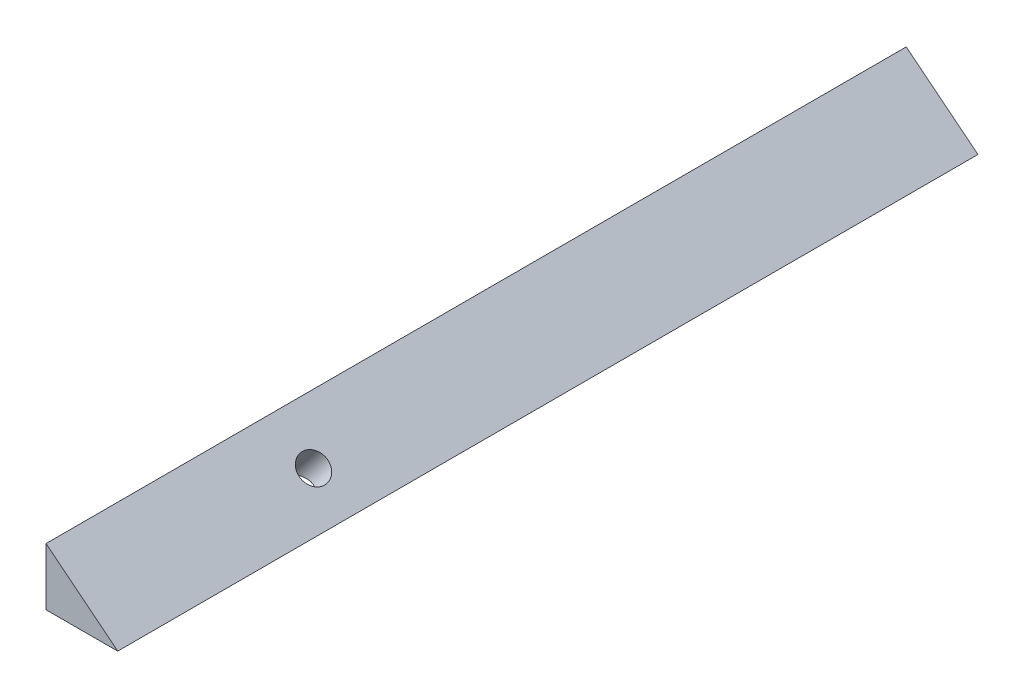
ISO-10303-21;
HEADER;
FILE_DESCRIPTION(('STEP AP214'),'2;1');
FILE_NAME('part.step','',(''),(''),'','','');
FILE_SCHEMA(('AUTOMOTIVE_DESIGN { 1 0 10303 214 1 1 1 1 }'));
ENDSEC;
DATA;
#1=APPLICATION_CONTEXT('core data for automotive mechanical design processes');
#2=APPLICATION_PROTOCOL_DEFINITION('international standard','automotive_design',2000,#1);
#3=PRODUCT_CONTEXT('',#1,'mechanical');
#4=PRODUCT('Part','Part','',(#3));
#5=PRODUCT_RELATED_PRODUCT_CATEGORY('part','',(#4));
#6=PRODUCT_DEFINITION_FORMATION('','',#4);
#7=PRODUCT_DEFINITION_CONTEXT('part definition',#1,'design');
#8=PRODUCT_DEFINITION('design','',#6,#7);
#9=PRODUCT_DEFINITION_SHAPE('','',#8);
#10=(LENGTH_UNIT() NAMED_UNIT(*) SI_UNIT(.MILLI.,.METRE.));
#11=(NAMED_UNIT(*) PLANE_ANGLE_UNIT() SI_UNIT($,.RADIAN.));
#12=(NAMED_UNIT(*) SI_UNIT($,.STERADIAN.) SOLID_ANGLE_UNIT());
#13=UNCERTAINTY_MEASURE_WITH_UNIT(LENGTH_MEASURE(1.E-05),#10,'distance_accuracy_value','');
#14=(GEOMETRIC_REPRESENTATION_CONTEXT(3) GLOBAL_UNCERTAINTY_ASSIGNED_CONTEXT((#13)) GLOBAL_UNIT_ASSIGNED_CONTEXT((#10,
#11,#12)) REPRESENTATION_CONTEXT('',''));
#15=CARTESIAN_POINT('',(0.,0.,0.));
#16=DIRECTION('',(0.,0.,1.));
#17=DIRECTION('',(1.,0.,0.));
#18=AXIS2_PLACEMENT_3D('',#15,#16,#17);
#19=CARTESIAN_POINT('',(0.,0.,-38.1));
#20=DIRECTION('',(1.,0.,0.));
#21=DIRECTION('',(0.,0.,-1.));
#22=AXIS2_PLACEMENT_3D('',#19,#20,#21);
#23=PLANE('',#22);
#24=DIRECTION('',(0.,0.,1.));
#25=VECTOR('',#24,1.);
#26=CARTESIAN_POINT('',(0.,0.,-38.1));
#27=LINE('',#26,#25);
#28=CARTESIAN_POINT('',(0.,0.,-469.9));
#29=VERTEX_POINT('',#28);
#30=CARTESIAN_POINT('',(0.,0.,83.4795863754));
#31=VERTEX_POINT('',#30);
#32=EDGE_CURVE('E79',#29,#31,#27,.T.);
#33=ORIENTED_EDGE('',*,*,#32,.T.);
#34=CARTESIAN_POINT('',(0.,-18.385241638452,88.9));
#35=DIRECTION('',(1.,0.,0.));
#36=DIRECTION('',(0.,1.,0.));
#37=AXIS2_PLACEMENT_3D('',#34,#35,#36);
#38=ELLIPSE('',#37,20.3299194538493,12.7);
#39=CARTESIAN_POINT('',(0.,0.,94.3204136245998));
#40=VERTEX_POINT('',#39);
#41=EDGE_CURVE('E46',#31,#40,#38,.T.);
#42=ORIENTED_EDGE('',*,*,#41,.T.);
#43=CARTESIAN_POINT('',(0.,0.,292.1));
#44=VERTEX_POINT('',#43);
#45=EDGE_CURVE('E76',#40,#44,#27,.T.);
#46=ORIENTED_EDGE('',*,*,#45,.T.);
#47=DIRECTION('',(0.,-1.,0.));
#48=VECTOR('',#47,1.);
#49=CARTESIAN_POINT('',(0.,50.8,292.1));
#50=LINE('',#49,#48);
#51=CARTESIAN_POINT('',(0.,50.8,292.1));
#52=VERTEX_POINT('',#51);
#53=EDGE_CURVE('E85',#52,#44,#50,.T.);
#54=ORIENTED_EDGE('',*,*,#53,.F.);
#55=DIRECTION('',(0.,0.,1.));
#56=VECTOR('',#55,1.);
#57=CARTESIAN_POINT('',(0.,50.8,-38.1));
#58=LINE('',#57,#56);
#59=CARTESIAN_POINT('',(0.,50.8,-469.9));
#60=VERTEX_POINT('',#59);
#61=EDGE_CURVE('E41',#60,#52,#58,.T.);
#62=ORIENTED_EDGE('',*,*,#61,.F.);
#63=DIRECTION('',(0.,1.,0.));
#64=VECTOR('',#63,1.);
#65=CARTESIAN_POINT('',(0.,0.,-469.9));
#66=LINE('',#65,#64);
#67=EDGE_CURVE('E80',#29,#60,#66,.T.);
#68=ORIENTED_EDGE('',*,*,#67,.F.);
#69=EDGE_LOOP('',(#33,#42,#46,#54,#62,#68));
#70=FACE_BOUND('',#69,.T.);
#71=ADVANCED_FACE('F34',(#70),#23,.F.);
#72=CARTESIAN_POINT('',(24.7804878048781,30.9756097560976,-38.1));
#73=DIRECTION('',(0.624695047554424,0.78086880944303,0.));
#74=DIRECTION('',(-0.78086880944303,0.624695047554424,0.));
#75=AXIS2_PLACEMENT_3D('',#72,#73,#74);
#76=PLANE('',#75);
#77=CARTESIAN_POINT('',(33.7488983602206,23.8008813118236,88.9));
#78=DIRECTION('',(0.624695047554424,0.78086880944303,0.));
#79=DIRECTION('',(-0.78086880944303,0.624695047554424,0.));
#80=AXIS2_PLACEMENT_3D('',#77,#78,#79);
#81=CIRCLE('',#80,12.7);
#82=CARTESIAN_POINT('',(23.8318644802941,31.7345084157648,88.9));
#83=VERTEX_POINT('',#82);
#84=EDGE_CURVE('E81',#83,#83,#81,.T.);
#85=ORIENTED_EDGE('',*,*,#84,.F.);
#86=EDGE_LOOP('',(#85));
#87=FACE_BOUND('',#86,.T.);
#88=ORIENTED_EDGE('',*,*,#61,.T.);
#89=DIRECTION('',(-0.78086880944303,0.624695047554424,0.));
#90=VECTOR('',#89,1.);
#91=CARTESIAN_POINT('',(63.5,0.,292.1));
#92=LINE('',#91,#90);
#93=CARTESIAN_POINT('',(63.5,0.,292.1));
#94=VERTEX_POINT('',#93);
#95=EDGE_CURVE('E91',#94,#52,#92,.T.);
#96=ORIENTED_EDGE('',*,*,#95,.F.);
#97=DIRECTION('',(0.,0.,1.));
#98=VECTOR('',#97,1.);
#99=CARTESIAN_POINT('',(63.5,0.,-38.1));
#100=LINE('',#99,#98);
#101=CARTESIAN_POINT('',(63.5,0.,-469.9));
#102=VERTEX_POINT('',#101);
#103=EDGE_CURVE('E54',#102,#94,#100,.T.);
#104=ORIENTED_EDGE('',*,*,#103,.F.);
#105=DIRECTION('',(0.78086880944303,-0.624695047554424,0.));
#106=VECTOR('',#105,1.);
#107=CARTESIAN_POINT('',(0.,50.8,-469.9));
#108=LINE('',#107,#106);
#109=EDGE_CURVE('E97',#60,#102,#108,.T.);
#110=ORIENTED_EDGE('',*,*,#109,.F.);
#111=EDGE_LOOP('',(#88,#96,#104,#110));
#112=FACE_BOUND('',#111,.T.);
#113=ADVANCED_FACE('F106',(#87,#112),#76,.T.);
#114=CARTESIAN_POINT('',(0.,0.,-38.1));
#115=DIRECTION('',(0.,-1.,0.));
#116=DIRECTION('',(0.,0.,-1.));
#117=AXIS2_PLACEMENT_3D('',#114,#115,#116);
#118=PLANE('',#117);
#119=CARTESIAN_POINT('',(14.7081933107616,0.,88.9));
#120=DIRECTION('',(0.,-1.,0.));
#121=DIRECTION('',(1.,0.,0.));
#122=AXIS2_PLACEMENT_3D('',#119,#120,#121);
#123=ELLIPSE('',#122,16.2639355630794,12.7);
#124=EDGE_CURVE('E11',#31,#40,#123,.T.);
#125=ORIENTED_EDGE('',*,*,#124,.F.);
#126=ORIENTED_EDGE('',*,*,#32,.F.);
#127=DIRECTION('',(-1.,0.,0.));
#128=VECTOR('',#127,1.);
#129=CARTESIAN_POINT('',(63.5,0.,-469.9));
#130=LINE('',#129,#128);
#131=EDGE_CURVE('E94',#102,#29,#130,.T.);
#132=ORIENTED_EDGE('',*,*,#131,.F.);
#133=ORIENTED_EDGE('',*,*,#103,.T.);
#134=DIRECTION('',(1.,0.,0.));
#135=VECTOR('',#134,1.);
#136=CARTESIAN_POINT('',(0.,0.,292.1));
#137=LINE('',#136,#135);
#138=EDGE_CURVE('E84',#44,#94,#137,.T.);
#139=ORIENTED_EDGE('',*,*,#138,.F.);
#140=ORIENTED_EDGE('',*,*,#45,.F.);
#141=EDGE_LOOP('',(#125,#126,#132,#133,#139,#140));
#142=FACE_BOUND('',#141,.T.);
#143=ADVANCED_FACE('F83',(#142),#118,.T.);
#144=CARTESIAN_POINT('',(0.,0.,292.1));
#145=DIRECTION('',(0.,0.,1.));
#146=DIRECTION('',(1.,0.,0.));
#147=AXIS2_PLACEMENT_3D('',#144,#145,#146);
#148=PLANE('',#147);
#149=ORIENTED_EDGE('',*,*,#95,.T.);
#150=ORIENTED_EDGE('',*,*,#53,.T.);
#151=ORIENTED_EDGE('',*,*,#138,.T.);
#152=EDGE_LOOP('',(#149,#150,#151));
#153=FACE_BOUND('',#152,.T.);
#154=ADVANCED_FACE('F113',(#153),#148,.T.);
#155=CARTESIAN_POINT('',(0.,0.,-469.9));
#156=DIRECTION('',(0.,0.,1.));
#157=DIRECTION('',(1.,0.,0.));
#158=AXIS2_PLACEMENT_3D('',#155,#156,#157);
#159=PLANE('',#158);
#160=ORIENTED_EDGE('',*,*,#67,.T.);
#161=ORIENTED_EDGE('',*,*,#109,.T.);
#162=ORIENTED_EDGE('',*,*,#131,.T.);
#163=EDGE_LOOP('',(#160,#161,#162));
#164=FACE_BOUND('',#163,.T.);
#165=ADVANCED_FACE('F115',(#164),#159,.F.);
#166=CARTESIAN_POINT('',(-235.99442317378,-313.378270605677,88.9));
#167=DIRECTION('',(0.624695047554424,0.78086880944303,0.));
#168=DIRECTION('',(-0.78086880944303,0.624695047554424,0.));
#169=AXIS2_PLACEMENT_3D('',#166,#167,#168);
#170=CYLINDRICAL_SURFACE('',#169,12.7);
#171=ORIENTED_EDGE('',*,*,#84,.T.);
#172=EDGE_LOOP('',(#171));
#173=FACE_BOUND('',#172,.T.);
#174=ORIENTED_EDGE('',*,*,#124,.T.);
#175=ORIENTED_EDGE('',*,*,#41,.F.);
#176=EDGE_LOOP('',(#174,#175));
#177=FACE_BOUND('',#176,.T.);
#178=ADVANCED_FACE('F71',(#173,#177),#170,.F.);
#179=CLOSED_SHELL('',(#71,#113,#143,#154,#165,#178));
#180=MANIFOLD_SOLID_BREP('B2',#179);
#181=ADVANCED_BREP_SHAPE_REPRESENTATION('',(#18,#180),#14);
#182=SHAPE_DEFINITION_REPRESENTATION(#9,#181);
ENDSEC;
END-ISO-10303-21;
